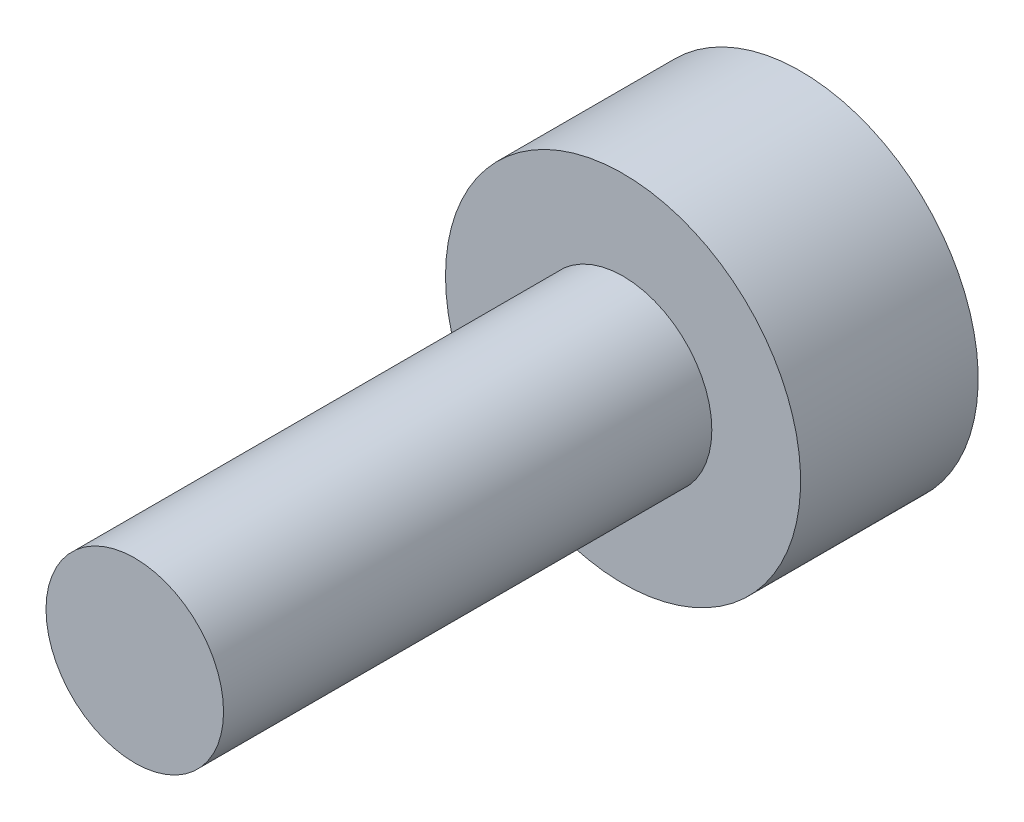
ISO-10303-21;
HEADER;
FILE_DESCRIPTION(('STEP AP214'),'2;1');
FILE_NAME('part.step','',(''),(''),'','','');
FILE_SCHEMA(('AUTOMOTIVE_DESIGN { 1 0 10303 214 1 1 1 1 }'));
ENDSEC;
DATA;
#1=APPLICATION_CONTEXT('core data for automotive mechanical design processes');
#2=APPLICATION_PROTOCOL_DEFINITION('international standard','automotive_design',2000,#1);
#3=PRODUCT_CONTEXT('',#1,'mechanical');
#4=PRODUCT('Part','Part','',(#3));
#5=PRODUCT_RELATED_PRODUCT_CATEGORY('part','',(#4));
#6=PRODUCT_DEFINITION_FORMATION('','',#4);
#7=PRODUCT_DEFINITION_CONTEXT('part definition',#1,'design');
#8=PRODUCT_DEFINITION('design','',#6,#7);
#9=PRODUCT_DEFINITION_SHAPE('','',#8);
#10=(LENGTH_UNIT() NAMED_UNIT(*) SI_UNIT(.MILLI.,.METRE.));
#11=(NAMED_UNIT(*) PLANE_ANGLE_UNIT() SI_UNIT($,.RADIAN.));
#12=(NAMED_UNIT(*) SI_UNIT($,.STERADIAN.) SOLID_ANGLE_UNIT());
#13=UNCERTAINTY_MEASURE_WITH_UNIT(LENGTH_MEASURE(1.E-05),#10,'distance_accuracy_value','');
#14=(GEOMETRIC_REPRESENTATION_CONTEXT(3) GLOBAL_UNCERTAINTY_ASSIGNED_CONTEXT((#13)) GLOBAL_UNIT_ASSIGNED_CONTEXT((#10,
#11,#12)) REPRESENTATION_CONTEXT('',''));
#15=CARTESIAN_POINT('',(0.,0.,0.));
#16=DIRECTION('',(0.,0.,1.));
#17=DIRECTION('',(1.,0.,0.));
#18=AXIS2_PLACEMENT_3D('',#15,#16,#17);
#19=CARTESIAN_POINT('',(0.,0.,5.5));
#20=DIRECTION('',(0.,0.,-1.));
#21=DIRECTION('',(-1.,0.,0.));
#22=AXIS2_PLACEMENT_3D('',#19,#20,#21);
#23=CYLINDRICAL_SURFACE('',#22,1.);
#24=CARTESIAN_POINT('',(0.,0.,5.5));
#25=DIRECTION('',(0.,0.,1.));
#26=DIRECTION('',(1.,0.,0.));
#27=AXIS2_PLACEMENT_3D('',#24,#25,#26);
#28=CIRCLE('',#27,1.);
#29=CARTESIAN_POINT('',(1.,0.,5.5));
#30=VERTEX_POINT('',#29);
#31=EDGE_CURVE('E11',#30,#30,#28,.T.);
#32=ORIENTED_EDGE('',*,*,#31,.F.);
#33=EDGE_LOOP('',(#32));
#34=FACE_BOUND('',#33,.T.);
#35=CARTESIAN_POINT('',(0.,0.,0.));
#36=DIRECTION('',(0.,0.,1.));
#37=DIRECTION('',(1.,0.,0.));
#38=AXIS2_PLACEMENT_3D('',#35,#36,#37);
#39=CIRCLE('',#38,1.);
#40=CARTESIAN_POINT('',(1.,0.,0.));
#41=VERTEX_POINT('',#40);
#42=EDGE_CURVE('E35',#41,#41,#39,.T.);
#43=ORIENTED_EDGE('',*,*,#42,.T.);
#44=EDGE_LOOP('',(#43));
#45=FACE_BOUND('',#44,.T.);
#46=ADVANCED_FACE('F32',(#34,#45),#23,.T.);
#47=CARTESIAN_POINT('',(0.,0.,5.5));
#48=DIRECTION('',(0.,0.,1.));
#49=DIRECTION('',(1.,0.,0.));
#50=AXIS2_PLACEMENT_3D('',#47,#48,#49);
#51=PLANE('',#50);
#52=ORIENTED_EDGE('',*,*,#31,.T.);
#53=EDGE_LOOP('',(#52));
#54=FACE_BOUND('',#53,.T.);
#55=ADVANCED_FACE('F164',(#54),#51,.T.);
#56=CARTESIAN_POINT('',(0.,0.,-2.));
#57=DIRECTION('',(0.,0.,1.));
#58=DIRECTION('',(1.,0.,0.));
#59=AXIS2_PLACEMENT_3D('',#56,#57,#58);
#60=CYLINDRICAL_SURFACE('',#59,2.);
#61=CARTESIAN_POINT('',(0.,0.,-2.));
#62=DIRECTION('',(0.,0.,-1.));
#63=DIRECTION('',(-1.,0.,0.));
#64=AXIS2_PLACEMENT_3D('',#61,#62,#63);
#65=CIRCLE('',#64,2.);
#66=CARTESIAN_POINT('',(-2.,0.,-2.));
#67=VERTEX_POINT('',#66);
#68=EDGE_CURVE('E139',#67,#67,#65,.T.);
#69=ORIENTED_EDGE('',*,*,#68,.F.);
#70=EDGE_LOOP('',(#69));
#71=FACE_BOUND('',#70,.T.);
#72=CARTESIAN_POINT('',(0.,0.,0.));
#73=DIRECTION('',(0.,0.,-1.));
#74=DIRECTION('',(-1.,0.,0.));
#75=AXIS2_PLACEMENT_3D('',#72,#73,#74);
#76=CIRCLE('',#75,2.);
#77=CARTESIAN_POINT('',(-2.,0.,0.));
#78=VERTEX_POINT('',#77);
#79=EDGE_CURVE('E133',#78,#78,#76,.T.);
#80=ORIENTED_EDGE('',*,*,#79,.T.);
#81=EDGE_LOOP('',(#80));
#82=FACE_BOUND('',#81,.T.);
#83=ADVANCED_FACE('F145',(#71,#82),#60,.T.);
#84=CARTESIAN_POINT('',(0.,0.,-2.));
#85=DIRECTION('',(0.,0.,-1.));
#86=DIRECTION('',(-1.,0.,0.));
#87=AXIS2_PLACEMENT_3D('',#84,#85,#86);
#88=PLANE('',#87);
#89=DIRECTION('',(-0.5,0.866025403784439,0.));
#90=VECTOR('',#89,1.);
#91=CARTESIAN_POINT('',(-0.5,-0.866025403784439,-2.));
#92=LINE('',#91,#90);
#93=CARTESIAN_POINT('',(-0.5,-0.866025403784439,-2.));
#94=VERTEX_POINT('',#93);
#95=CARTESIAN_POINT('',(-1.,0.,-2.));
#96=VERTEX_POINT('',#95);
#97=EDGE_CURVE('E46',#94,#96,#92,.T.);
#98=ORIENTED_EDGE('',*,*,#97,.F.);
#99=DIRECTION('',(-1.,0.,0.));
#100=VECTOR('',#99,1.);
#101=CARTESIAN_POINT('',(0.5,-0.866025403784439,-2.));
#102=LINE('',#101,#100);
#103=CARTESIAN_POINT('',(0.5,-0.866025403784439,-2.));
#104=VERTEX_POINT('',#103);
#105=EDGE_CURVE('E129',#104,#94,#102,.T.);
#106=ORIENTED_EDGE('',*,*,#105,.F.);
#107=DIRECTION('',(-0.5,-0.866025403784439,0.));
#108=VECTOR('',#107,1.);
#109=CARTESIAN_POINT('',(1.,0.,-2.));
#110=LINE('',#109,#108);
#111=CARTESIAN_POINT('',(1.,0.,-2.));
#112=VERTEX_POINT('',#111);
#113=EDGE_CURVE('E127',#112,#104,#110,.T.);
#114=ORIENTED_EDGE('',*,*,#113,.F.);
#115=DIRECTION('',(0.5,-0.866025403784439,0.));
#116=VECTOR('',#115,1.);
#117=CARTESIAN_POINT('',(0.5,0.866025403784439,-2.));
#118=LINE('',#117,#116);
#119=CARTESIAN_POINT('',(0.5,0.866025403784439,-2.));
#120=VERTEX_POINT('',#119);
#121=EDGE_CURVE('E94',#120,#112,#118,.T.);
#122=ORIENTED_EDGE('',*,*,#121,.F.);
#123=DIRECTION('',(1.,0.,0.));
#124=VECTOR('',#123,1.);
#125=CARTESIAN_POINT('',(-0.5,0.866025403784439,-2.));
#126=LINE('',#125,#124);
#127=CARTESIAN_POINT('',(-0.5,0.866025403784439,-2.));
#128=VERTEX_POINT('',#127);
#129=EDGE_CURVE('E123',#128,#120,#126,.T.);
#130=ORIENTED_EDGE('',*,*,#129,.F.);
#131=DIRECTION('',(0.5,0.866025403784438,0.));
#132=VECTOR('',#131,1.);
#133=CARTESIAN_POINT('',(-1.,0.,-2.));
#134=LINE('',#133,#132);
#135=EDGE_CURVE('E120',#96,#128,#134,.T.);
#136=ORIENTED_EDGE('',*,*,#135,.F.);
#137=EDGE_LOOP('',(#98,#106,#114,#122,#130,#136));
#138=FACE_BOUND('',#137,.T.);
#139=ORIENTED_EDGE('',*,*,#68,.T.);
#140=EDGE_LOOP('',(#139));
#141=FACE_BOUND('',#140,.T.);
#142=ADVANCED_FACE('F150',(#138,#141),#88,.T.);
#143=CARTESIAN_POINT('',(0.,0.,0.));
#144=DIRECTION('',(0.,0.,-1.));
#145=DIRECTION('',(-1.,0.,0.));
#146=AXIS2_PLACEMENT_3D('',#143,#144,#145);
#147=PLANE('',#146);
#148=ORIENTED_EDGE('',*,*,#42,.F.);
#149=EDGE_LOOP('',(#148));
#150=FACE_BOUND('',#149,.T.);
#151=ORIENTED_EDGE('',*,*,#79,.F.);
#152=EDGE_LOOP('',(#151));
#153=FACE_BOUND('',#152,.T.);
#154=ADVANCED_FACE('F147',(#150,#153),#147,.F.);
#155=CARTESIAN_POINT('',(-0.5,-0.866025403784439,-1.));
#156=DIRECTION('',(-0.866025403784439,-0.5,0.));
#157=DIRECTION('',(0.5,-0.866025403784439,0.));
#158=AXIS2_PLACEMENT_3D('',#155,#156,#157);
#159=PLANE('',#158);
#160=ORIENTED_EDGE('',*,*,#97,.T.);
#161=DIRECTION('',(0.,0.,-1.));
#162=VECTOR('',#161,1.);
#163=CARTESIAN_POINT('',(-1.,0.,-1.));
#164=LINE('',#163,#162);
#165=CARTESIAN_POINT('',(-1.,0.,-1.));
#166=VERTEX_POINT('',#165);
#167=EDGE_CURVE('E76',#166,#96,#164,.T.);
#168=ORIENTED_EDGE('',*,*,#167,.F.);
#169=DIRECTION('',(-0.5,0.866025403784439,0.));
#170=VECTOR('',#169,1.);
#171=CARTESIAN_POINT('',(-0.5,-0.866025403784439,-1.));
#172=LINE('',#171,#170);
#173=CARTESIAN_POINT('',(-0.5,-0.866025403784439,-1.));
#174=VERTEX_POINT('',#173);
#175=EDGE_CURVE('E131',#174,#166,#172,.T.);
#176=ORIENTED_EDGE('',*,*,#175,.F.);
#177=DIRECTION('',(0.,0.,-1.));
#178=VECTOR('',#177,1.);
#179=CARTESIAN_POINT('',(-0.5,-0.866025403784439,-1.));
#180=LINE('',#179,#178);
#181=EDGE_CURVE('E54',#174,#94,#180,.T.);
#182=ORIENTED_EDGE('',*,*,#181,.T.);
#183=EDGE_LOOP('',(#160,#168,#176,#182));
#184=FACE_BOUND('',#183,.T.);
#185=ADVANCED_FACE('F149',(#184),#159,.F.);
#186=CARTESIAN_POINT('',(0.5,-0.866025403784439,-1.));
#187=DIRECTION('',(0.,-1.,0.));
#188=DIRECTION('',(0.,0.,-1.));
#189=AXIS2_PLACEMENT_3D('',#186,#187,#188);
#190=PLANE('',#189);
#191=ORIENTED_EDGE('',*,*,#105,.T.);
#192=ORIENTED_EDGE('',*,*,#181,.F.);
#193=DIRECTION('',(-1.,0.,0.));
#194=VECTOR('',#193,1.);
#195=CARTESIAN_POINT('',(0.5,-0.866025403784439,-1.));
#196=LINE('',#195,#194);
#197=CARTESIAN_POINT('',(0.5,-0.866025403784439,-1.));
#198=VERTEX_POINT('',#197);
#199=EDGE_CURVE('E106',#198,#174,#196,.T.);
#200=ORIENTED_EDGE('',*,*,#199,.F.);
#201=DIRECTION('',(0.,0.,-1.));
#202=VECTOR('',#201,1.);
#203=CARTESIAN_POINT('',(0.5,-0.866025403784439,-1.));
#204=LINE('',#203,#202);
#205=EDGE_CURVE('E98',#198,#104,#204,.T.);
#206=ORIENTED_EDGE('',*,*,#205,.T.);
#207=EDGE_LOOP('',(#191,#192,#200,#206));
#208=FACE_BOUND('',#207,.T.);
#209=ADVANCED_FACE('F157',(#208),#190,.F.);
#210=CARTESIAN_POINT('',(1.,0.,-1.));
#211=DIRECTION('',(0.866025403784439,-0.5,0.));
#212=DIRECTION('',(0.5,0.866025403784439,0.));
#213=AXIS2_PLACEMENT_3D('',#210,#211,#212);
#214=PLANE('',#213);
#215=ORIENTED_EDGE('',*,*,#113,.T.);
#216=ORIENTED_EDGE('',*,*,#205,.F.);
#217=DIRECTION('',(-0.5,-0.866025403784439,0.));
#218=VECTOR('',#217,1.);
#219=CARTESIAN_POINT('',(1.,0.,-1.));
#220=LINE('',#219,#218);
#221=CARTESIAN_POINT('',(1.,0.,-1.));
#222=VERTEX_POINT('',#221);
#223=EDGE_CURVE('E102',#222,#198,#220,.T.);
#224=ORIENTED_EDGE('',*,*,#223,.F.);
#225=DIRECTION('',(0.,0.,-1.));
#226=VECTOR('',#225,1.);
#227=CARTESIAN_POINT('',(1.,0.,-1.));
#228=LINE('',#227,#226);
#229=EDGE_CURVE('E87',#222,#112,#228,.T.);
#230=ORIENTED_EDGE('',*,*,#229,.T.);
#231=EDGE_LOOP('',(#215,#216,#224,#230));
#232=FACE_BOUND('',#231,.T.);
#233=ADVANCED_FACE('F103',(#232),#214,.F.);
#234=CARTESIAN_POINT('',(0.5,0.866025403784439,-1.));
#235=DIRECTION('',(0.866025403784439,0.5,0.));
#236=DIRECTION('',(-0.5,0.866025403784439,0.));
#237=AXIS2_PLACEMENT_3D('',#234,#235,#236);
#238=PLANE('',#237);
#239=ORIENTED_EDGE('',*,*,#121,.T.);
#240=ORIENTED_EDGE('',*,*,#229,.F.);
#241=DIRECTION('',(0.5,-0.866025403784439,0.));
#242=VECTOR('',#241,1.);
#243=CARTESIAN_POINT('',(0.5,0.866025403784439,-1.));
#244=LINE('',#243,#242);
#245=CARTESIAN_POINT('',(0.5,0.866025403784439,-1.));
#246=VERTEX_POINT('',#245);
#247=EDGE_CURVE('E91',#246,#222,#244,.T.);
#248=ORIENTED_EDGE('',*,*,#247,.F.);
#249=DIRECTION('',(0.,0.,-1.));
#250=VECTOR('',#249,1.);
#251=CARTESIAN_POINT('',(0.5,0.866025403784439,-1.));
#252=LINE('',#251,#250);
#253=EDGE_CURVE('E99',#246,#120,#252,.T.);
#254=ORIENTED_EDGE('',*,*,#253,.T.);
#255=EDGE_LOOP('',(#239,#240,#248,#254));
#256=FACE_BOUND('',#255,.T.);
#257=ADVANCED_FACE('F89',(#256),#238,.F.);
#258=CARTESIAN_POINT('',(-0.5,0.866025403784439,-1.));
#259=DIRECTION('',(0.,1.,0.));
#260=DIRECTION('',(-1.,0.,0.));
#261=AXIS2_PLACEMENT_3D('',#258,#259,#260);
#262=PLANE('',#261);
#263=ORIENTED_EDGE('',*,*,#129,.T.);
#264=ORIENTED_EDGE('',*,*,#253,.F.);
#265=DIRECTION('',(1.,0.,0.));
#266=VECTOR('',#265,1.);
#267=CARTESIAN_POINT('',(-0.5,0.866025403784439,-1.));
#268=LINE('',#267,#266);
#269=CARTESIAN_POINT('',(-0.5,0.866025403784439,-1.));
#270=VERTEX_POINT('',#269);
#271=EDGE_CURVE('E112',#270,#246,#268,.T.);
#272=ORIENTED_EDGE('',*,*,#271,.F.);
#273=DIRECTION('',(0.,0.,-1.));
#274=VECTOR('',#273,1.);
#275=CARTESIAN_POINT('',(-0.5,0.866025403784439,-1.));
#276=LINE('',#275,#274);
#277=EDGE_CURVE('E136',#270,#128,#276,.T.);
#278=ORIENTED_EDGE('',*,*,#277,.T.);
#279=EDGE_LOOP('',(#263,#264,#272,#278));
#280=FACE_BOUND('',#279,.T.);
#281=ADVANCED_FACE('F218',(#280),#262,.F.);
#282=CARTESIAN_POINT('',(-1.,0.,-1.));
#283=DIRECTION('',(-0.866025403784439,0.5,0.));
#284=DIRECTION('',(-0.5,-0.866025403784438,0.));
#285=AXIS2_PLACEMENT_3D('',#282,#283,#284);
#286=PLANE('',#285);
#287=ORIENTED_EDGE('',*,*,#135,.T.);
#288=ORIENTED_EDGE('',*,*,#277,.F.);
#289=DIRECTION('',(0.5,0.866025403784438,0.));
#290=VECTOR('',#289,1.);
#291=CARTESIAN_POINT('',(-1.,0.,-1.));
#292=LINE('',#291,#290);
#293=EDGE_CURVE('E114',#166,#270,#292,.T.);
#294=ORIENTED_EDGE('',*,*,#293,.F.);
#295=ORIENTED_EDGE('',*,*,#167,.T.);
#296=EDGE_LOOP('',(#287,#288,#294,#295));
#297=FACE_BOUND('',#296,.T.);
#298=ADVANCED_FACE('F227',(#297),#286,.F.);
#299=CARTESIAN_POINT('',(0.,0.,-1.));
#300=DIRECTION('',(0.,0.,-1.));
#301=DIRECTION('',(-1.,0.,0.));
#302=AXIS2_PLACEMENT_3D('',#299,#300,#301);
#303=PLANE('',#302);
#304=ORIENTED_EDGE('',*,*,#175,.T.);
#305=ORIENTED_EDGE('',*,*,#293,.T.);
#306=ORIENTED_EDGE('',*,*,#271,.T.);
#307=ORIENTED_EDGE('',*,*,#247,.T.);
#308=ORIENTED_EDGE('',*,*,#223,.T.);
#309=ORIENTED_EDGE('',*,*,#199,.T.);
#310=EDGE_LOOP('',(#304,#305,#306,#307,#308,#309));
#311=FACE_BOUND('',#310,.T.);
#312=ADVANCED_FACE('F109',(#311),#303,.T.);
#313=CLOSED_SHELL('',(#46,#55,#83,#142,#154,#185,#209,#233,#257,#281,#298,#312));
#314=MANIFOLD_SOLID_BREP('B2',#313);
#315=ADVANCED_BREP_SHAPE_REPRESENTATION('',(#18,#314),#14);
#316=SHAPE_DEFINITION_REPRESENTATION(#9,#315);
ENDSEC;
END-ISO-10303-21;
